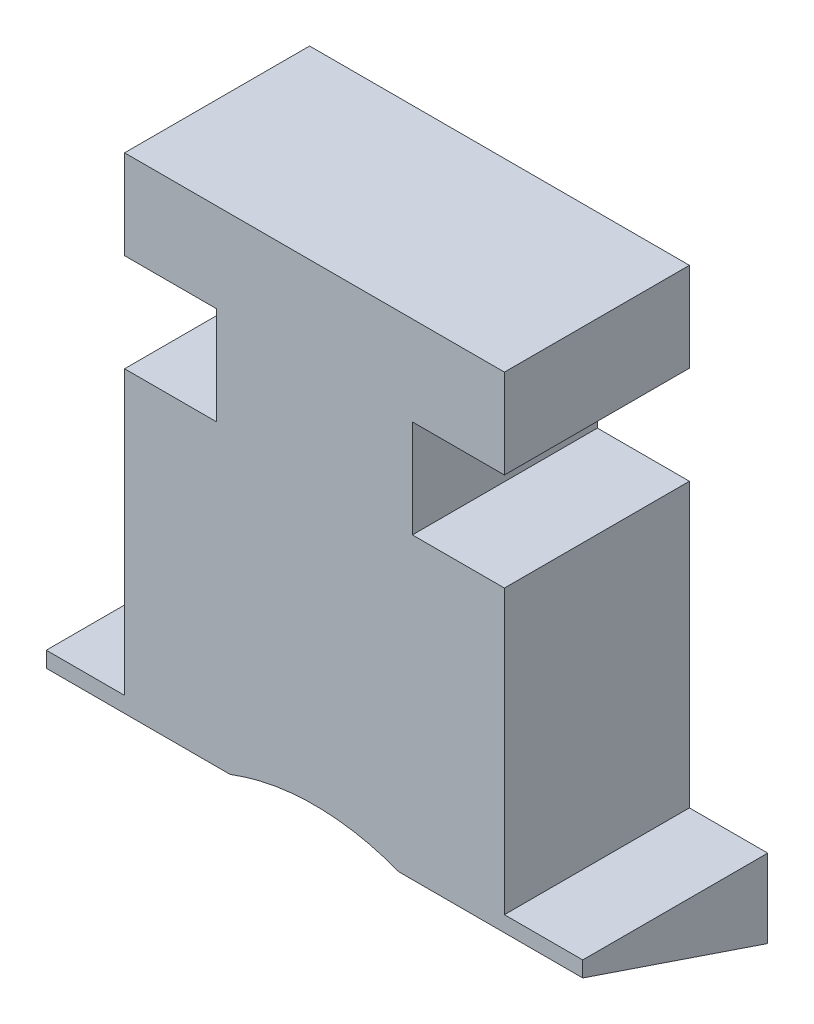
ISO-10303-21;
HEADER;
FILE_DESCRIPTION(('STEP AP214'),'2;1');
FILE_NAME('part.step','',(''),(''),'','','');
FILE_SCHEMA(('AUTOMOTIVE_DESIGN { 1 0 10303 214 1 1 1 1 }'));
ENDSEC;
DATA;
#1=APPLICATION_CONTEXT('core data for automotive mechanical design processes');
#2=APPLICATION_PROTOCOL_DEFINITION('international standard','automotive_design',2000,#1);
#3=PRODUCT_CONTEXT('',#1,'mechanical');
#4=PRODUCT('Part','Part','',(#3));
#5=PRODUCT_RELATED_PRODUCT_CATEGORY('part','',(#4));
#6=PRODUCT_DEFINITION_FORMATION('','',#4);
#7=PRODUCT_DEFINITION_CONTEXT('part definition',#1,'design');
#8=PRODUCT_DEFINITION('design','',#6,#7);
#9=PRODUCT_DEFINITION_SHAPE('','',#8);
#10=(LENGTH_UNIT() NAMED_UNIT(*) SI_UNIT(.MILLI.,.METRE.));
#11=(NAMED_UNIT(*) PLANE_ANGLE_UNIT() SI_UNIT($,.RADIAN.));
#12=(NAMED_UNIT(*) SI_UNIT($,.STERADIAN.) SOLID_ANGLE_UNIT());
#13=UNCERTAINTY_MEASURE_WITH_UNIT(LENGTH_MEASURE(1.E-05),#10,'distance_accuracy_value','');
#14=(GEOMETRIC_REPRESENTATION_CONTEXT(3) GLOBAL_UNCERTAINTY_ASSIGNED_CONTEXT((#13)) GLOBAL_UNIT_ASSIGNED_CONTEXT((#10,
#11,#12)) REPRESENTATION_CONTEXT('',''));
#15=CARTESIAN_POINT('',(0.,0.,0.));
#16=DIRECTION('',(0.,0.,1.));
#17=DIRECTION('',(1.,0.,0.));
#18=AXIS2_PLACEMENT_3D('',#15,#16,#17);
#19=CARTESIAN_POINT('',(6.1595,15.24,0.));
#20=DIRECTION('',(1.,0.,0.));
#21=DIRECTION('',(0.,0.,-1.));
#22=AXIS2_PLACEMENT_3D('',#19,#20,#21);
#23=PLANE('',#22);
#24=DIRECTION('',(0.,-1.,0.));
#25=VECTOR('',#24,1.);
#26=CARTESIAN_POINT('',(6.1595,15.24,3.));
#27=LINE('',#26,#25);
#28=CARTESIAN_POINT('',(6.1595,15.24,3.));
#29=VERTEX_POINT('',#28);
#30=CARTESIAN_POINT('',(6.1595,12.35,3.));
#31=VERTEX_POINT('',#30);
#32=EDGE_CURVE('E324',#29,#31,#27,.T.);
#33=ORIENTED_EDGE('',*,*,#32,.T.);
#34=DIRECTION('',(0.,0.,-1.));
#35=VECTOR('',#34,1.);
#36=CARTESIAN_POINT('',(6.1595,12.35,3.));
#37=LINE('',#36,#35);
#38=CARTESIAN_POINT('',(6.1595,12.35,-3.));
#39=VERTEX_POINT('',#38);
#40=EDGE_CURVE('E235',#31,#39,#37,.T.);
#41=ORIENTED_EDGE('',*,*,#40,.T.);
#42=DIRECTION('',(0.,-1.,0.));
#43=VECTOR('',#42,1.);
#44=CARTESIAN_POINT('',(6.1595,15.24,-3.));
#45=LINE('',#44,#43);
#46=CARTESIAN_POINT('',(6.1595,15.24,-3.));
#47=VERTEX_POINT('',#46);
#48=EDGE_CURVE('E339',#47,#39,#45,.T.);
#49=ORIENTED_EDGE('',*,*,#48,.F.);
#50=DIRECTION('',(0.,0.,1.));
#51=VECTOR('',#50,1.);
#52=CARTESIAN_POINT('',(6.1595,15.24,0.));
#53=LINE('',#52,#51);
#54=EDGE_CURVE('E302',#47,#29,#53,.T.);
#55=ORIENTED_EDGE('',*,*,#54,.T.);
#56=EDGE_LOOP('',(#33,#41,#49,#55));
#57=FACE_BOUND('',#56,.T.);
#58=ADVANCED_FACE('F48',(#57),#23,.T.);
#59=CARTESIAN_POINT('',(0.,15.24,-3.));
#60=DIRECTION('',(0.,0.,-1.));
#61=DIRECTION('',(-1.,0.,0.));
#62=AXIS2_PLACEMENT_3D('',#59,#60,#61);
#63=PLANE('',#62);
#64=DIRECTION('',(-1.,0.,0.));
#65=VECTOR('',#64,1.);
#66=CARTESIAN_POINT('',(0.,9.175,-3.));
#67=LINE('',#66,#65);
#68=CARTESIAN_POINT('',(6.1595,9.175,-3.));
#69=VERTEX_POINT('',#68);
#70=CARTESIAN_POINT('',(3.175,9.175,-3.));
#71=VERTEX_POINT('',#70);
#72=EDGE_CURVE('E208',#69,#71,#67,.T.);
#73=ORIENTED_EDGE('',*,*,#72,.F.);
#74=CARTESIAN_POINT('',(6.1595,0.,-3.));
#75=VERTEX_POINT('',#74);
#76=EDGE_CURVE('E338',#69,#75,#45,.T.);
#77=ORIENTED_EDGE('',*,*,#76,.T.);
#78=DIRECTION('',(1.,0.,0.));
#79=VECTOR('',#78,1.);
#80=CARTESIAN_POINT('',(0.,0.,-3.));
#81=LINE('',#80,#79);
#82=CARTESIAN_POINT('',(8.6995,0.,-3.));
#83=VERTEX_POINT('',#82);
#84=EDGE_CURVE('E281',#75,#83,#81,.T.);
#85=ORIENTED_EDGE('',*,*,#84,.T.);
#86=DIRECTION('',(0.,1.,0.));
#87=VECTOR('',#86,1.);
#88=CARTESIAN_POINT('',(8.6995,-2.54,-3.));
#89=LINE('',#88,#87);
#90=CARTESIAN_POINT('',(8.6995,-2.54,-3.));
#91=VERTEX_POINT('',#90);
#92=EDGE_CURVE('E296',#91,#83,#89,.T.);
#93=ORIENTED_EDGE('',*,*,#92,.F.);
#94=DIRECTION('',(1.,0.,0.));
#95=VECTOR('',#94,1.);
#96=CARTESIAN_POINT('',(0.,-2.54,-3.));
#97=LINE('',#96,#95);
#98=CARTESIAN_POINT('',(-8.6995,-2.54,-3.));
#99=VERTEX_POINT('',#98);
#100=EDGE_CURVE('E268',#99,#91,#97,.T.);
#101=ORIENTED_EDGE('',*,*,#100,.F.);
#102=DIRECTION('',(0.,1.,0.));
#103=VECTOR('',#102,1.);
#104=CARTESIAN_POINT('',(-8.6995,-2.54,-3.));
#105=LINE('',#104,#103);
#106=CARTESIAN_POINT('',(-8.6995,0.,-3.));
#107=VERTEX_POINT('',#106);
#108=EDGE_CURVE('E293',#99,#107,#105,.T.);
#109=ORIENTED_EDGE('',*,*,#108,.T.);
#110=CARTESIAN_POINT('',(-6.1595,0.,-3.));
#111=VERTEX_POINT('',#110);
#112=EDGE_CURVE('E282',#107,#111,#81,.T.);
#113=ORIENTED_EDGE('',*,*,#112,.T.);
#114=DIRECTION('',(0.,-1.,0.));
#115=VECTOR('',#114,1.);
#116=CARTESIAN_POINT('',(-6.1595,15.24,-3.));
#117=LINE('',#116,#115);
#118=CARTESIAN_POINT('',(-6.1595,9.175,-3.));
#119=VERTEX_POINT('',#118);
#120=EDGE_CURVE('E333',#119,#111,#117,.T.);
#121=ORIENTED_EDGE('',*,*,#120,.F.);
#122=DIRECTION('',(-1.,0.,0.));
#123=VECTOR('',#122,1.);
#124=CARTESIAN_POINT('',(0.,9.175,-3.));
#125=LINE('',#124,#123);
#126=CARTESIAN_POINT('',(-3.175,9.175,-3.));
#127=VERTEX_POINT('',#126);
#128=EDGE_CURVE('E245',#127,#119,#125,.T.);
#129=ORIENTED_EDGE('',*,*,#128,.F.);
#130=DIRECTION('',(0.,-1.,0.));
#131=VECTOR('',#130,1.);
#132=CARTESIAN_POINT('',(-3.17500000000001,0.,-3.));
#133=LINE('',#132,#131);
#134=CARTESIAN_POINT('',(-3.175,12.35,-3.));
#135=VERTEX_POINT('',#134);
#136=EDGE_CURVE('E198',#135,#127,#133,.T.);
#137=ORIENTED_EDGE('',*,*,#136,.F.);
#138=DIRECTION('',(-1.,0.,0.));
#139=VECTOR('',#138,1.);
#140=CARTESIAN_POINT('',(0.,12.35,-3.));
#141=LINE('',#140,#139);
#142=CARTESIAN_POINT('',(-6.1595,12.35,-3.));
#143=VERTEX_POINT('',#142);
#144=EDGE_CURVE('E193',#135,#143,#141,.T.);
#145=ORIENTED_EDGE('',*,*,#144,.T.);
#146=CARTESIAN_POINT('',(-6.1595,15.24,-3.));
#147=VERTEX_POINT('',#146);
#148=EDGE_CURVE('E334',#147,#143,#117,.T.);
#149=ORIENTED_EDGE('',*,*,#148,.F.);
#150=DIRECTION('',(1.,0.,0.));
#151=VECTOR('',#150,1.);
#152=CARTESIAN_POINT('',(0.,15.24,-3.));
#153=LINE('',#152,#151);
#154=EDGE_CURVE('E306',#147,#47,#153,.T.);
#155=ORIENTED_EDGE('',*,*,#154,.T.);
#156=ORIENTED_EDGE('',*,*,#48,.T.);
#157=DIRECTION('',(-1.,0.,0.));
#158=VECTOR('',#157,1.);
#159=CARTESIAN_POINT('',(0.,12.35,-3.));
#160=LINE('',#159,#158);
#161=CARTESIAN_POINT('',(3.175,12.35,-3.));
#162=VERTEX_POINT('',#161);
#163=EDGE_CURVE('E220',#39,#162,#160,.T.);
#164=ORIENTED_EDGE('',*,*,#163,.T.);
#165=DIRECTION('',(0.,-1.,0.));
#166=VECTOR('',#165,1.);
#167=CARTESIAN_POINT('',(3.175,0.,-3.));
#168=LINE('',#167,#166);
#169=EDGE_CURVE('E216',#162,#71,#168,.T.);
#170=ORIENTED_EDGE('',*,*,#169,.T.);
#171=EDGE_LOOP('',(#73,#77,#85,#93,#101,#109,#113,#121,#129,#137,#145,#149,#155,#156,#164,#170));
#172=FACE_BOUND('',#171,.T.);
#173=ADVANCED_FACE('F361',(#172),#63,.T.);
#174=CARTESIAN_POINT('',(-6.1595,15.24,0.));
#175=DIRECTION('',(1.,0.,0.));
#176=DIRECTION('',(0.,0.,-1.));
#177=AXIS2_PLACEMENT_3D('',#174,#175,#176);
#178=PLANE('',#177);
#179=DIRECTION('',(0.,0.,-1.));
#180=VECTOR('',#179,1.);
#181=CARTESIAN_POINT('',(-6.1595,12.35,3.));
#182=LINE('',#181,#180);
#183=CARTESIAN_POINT('',(-6.1595,12.35,3.));
#184=VERTEX_POINT('',#183);
#185=EDGE_CURVE('E221',#184,#143,#182,.T.);
#186=ORIENTED_EDGE('',*,*,#185,.F.);
#187=DIRECTION('',(0.,-1.,0.));
#188=VECTOR('',#187,1.);
#189=CARTESIAN_POINT('',(-6.1595,15.24,3.));
#190=LINE('',#189,#188);
#191=CARTESIAN_POINT('',(-6.1595,15.24,3.));
#192=VERTEX_POINT('',#191);
#193=EDGE_CURVE('E329',#192,#184,#190,.T.);
#194=ORIENTED_EDGE('',*,*,#193,.F.);
#195=DIRECTION('',(0.,0.,1.));
#196=VECTOR('',#195,1.);
#197=CARTESIAN_POINT('',(-6.1595,15.24,0.));
#198=LINE('',#197,#196);
#199=EDGE_CURVE('E311',#147,#192,#198,.T.);
#200=ORIENTED_EDGE('',*,*,#199,.F.);
#201=ORIENTED_EDGE('',*,*,#148,.T.);
#202=EDGE_LOOP('',(#186,#194,#200,#201));
#203=FACE_BOUND('',#202,.T.);
#204=ADVANCED_FACE('F410',(#203),#178,.F.);
#205=CARTESIAN_POINT('',(0.,15.24,3.));
#206=DIRECTION('',(0.,0.,-1.));
#207=DIRECTION('',(-1.,0.,0.));
#208=AXIS2_PLACEMENT_3D('',#205,#206,#207);
#209=PLANE('',#208);
#210=DIRECTION('',(-1.,0.,0.));
#211=VECTOR('',#210,1.);
#212=CARTESIAN_POINT('',(8.6995,-0.508,3.));
#213=LINE('',#212,#211);
#214=CARTESIAN_POINT('',(-2.73566372202433,-0.508000000000001,3.));
#215=VERTEX_POINT('',#214);
#216=CARTESIAN_POINT('',(-8.6995,-0.508,3.));
#217=VERTEX_POINT('',#216);
#218=EDGE_CURVE('E186',#215,#217,#213,.T.);
#219=ORIENTED_EDGE('',*,*,#218,.F.);
#220=CARTESIAN_POINT('',(0.,-7.62,3.));
#221=DIRECTION('',(0.,0.,1.));
#222=DIRECTION('',(1.,0.,0.));
#223=AXIS2_PLACEMENT_3D('',#220,#221,#222);
#224=CIRCLE('',#223,7.62);
#225=CARTESIAN_POINT('',(2.73566372202433,-0.508000000000001,3.));
#226=VERTEX_POINT('',#225);
#227=EDGE_CURVE('E174',#226,#215,#224,.T.);
#228=ORIENTED_EDGE('',*,*,#227,.F.);
#229=CARTESIAN_POINT('',(8.6995,-0.508,3.));
#230=VERTEX_POINT('',#229);
#231=EDGE_CURVE('E183',#230,#226,#213,.T.);
#232=ORIENTED_EDGE('',*,*,#231,.F.);
#233=DIRECTION('',(0.,1.,0.));
#234=VECTOR('',#233,1.);
#235=CARTESIAN_POINT('',(8.6995,-2.54,3.));
#236=LINE('',#235,#234);
#237=CARTESIAN_POINT('',(8.6995,0.,3.));
#238=VERTEX_POINT('',#237);
#239=EDGE_CURVE('E271',#230,#238,#236,.T.);
#240=ORIENTED_EDGE('',*,*,#239,.T.);
#241=DIRECTION('',(1.,0.,0.));
#242=VECTOR('',#241,1.);
#243=CARTESIAN_POINT('',(0.,0.,3.));
#244=LINE('',#243,#242);
#245=CARTESIAN_POINT('',(6.1595,0.,3.));
#246=VERTEX_POINT('',#245);
#247=EDGE_CURVE('E231',#246,#238,#244,.T.);
#248=ORIENTED_EDGE('',*,*,#247,.F.);
#249=CARTESIAN_POINT('',(6.1595,9.175,3.));
#250=VERTEX_POINT('',#249);
#251=EDGE_CURVE('E317',#250,#246,#27,.T.);
#252=ORIENTED_EDGE('',*,*,#251,.F.);
#253=DIRECTION('',(-1.,0.,0.));
#254=VECTOR('',#253,1.);
#255=CARTESIAN_POINT('',(0.,9.175,3.));
#256=LINE('',#255,#254);
#257=CARTESIAN_POINT('',(3.175,9.175,3.));
#258=VERTEX_POINT('',#257);
#259=EDGE_CURVE('E211',#250,#258,#256,.T.);
#260=ORIENTED_EDGE('',*,*,#259,.T.);
#261=DIRECTION('',(0.,-1.,0.));
#262=VECTOR('',#261,1.);
#263=CARTESIAN_POINT('',(3.175,0.,3.));
#264=LINE('',#263,#262);
#265=CARTESIAN_POINT('',(3.175,12.35,3.));
#266=VERTEX_POINT('',#265);
#267=EDGE_CURVE('E204',#266,#258,#264,.T.);
#268=ORIENTED_EDGE('',*,*,#267,.F.);
#269=DIRECTION('',(-1.,0.,0.));
#270=VECTOR('',#269,1.);
#271=CARTESIAN_POINT('',(0.,12.35,3.));
#272=LINE('',#271,#270);
#273=EDGE_CURVE('E207',#31,#266,#272,.T.);
#274=ORIENTED_EDGE('',*,*,#273,.F.);
#275=ORIENTED_EDGE('',*,*,#32,.F.);
#276=DIRECTION('',(1.,0.,0.));
#277=VECTOR('',#276,1.);
#278=CARTESIAN_POINT('',(0.,15.24,3.));
#279=LINE('',#278,#277);
#280=EDGE_CURVE('E314',#192,#29,#279,.T.);
#281=ORIENTED_EDGE('',*,*,#280,.F.);
#282=ORIENTED_EDGE('',*,*,#193,.T.);
#283=DIRECTION('',(-1.,0.,0.));
#284=VECTOR('',#283,1.);
#285=CARTESIAN_POINT('',(0.,12.35,3.));
#286=LINE('',#285,#284);
#287=CARTESIAN_POINT('',(-3.175,12.35,3.));
#288=VERTEX_POINT('',#287);
#289=EDGE_CURVE('E241',#288,#184,#286,.T.);
#290=ORIENTED_EDGE('',*,*,#289,.F.);
#291=DIRECTION('',(0.,-1.,0.));
#292=VECTOR('',#291,1.);
#293=CARTESIAN_POINT('',(-3.17500000000001,0.,3.));
#294=LINE('',#293,#292);
#295=CARTESIAN_POINT('',(-3.175,9.175,3.));
#296=VERTEX_POINT('',#295);
#297=EDGE_CURVE('E244',#288,#296,#294,.T.);
#298=ORIENTED_EDGE('',*,*,#297,.T.);
#299=DIRECTION('',(-1.,0.,0.));
#300=VECTOR('',#299,1.);
#301=CARTESIAN_POINT('',(0.,9.175,3.));
#302=LINE('',#301,#300);
#303=CARTESIAN_POINT('',(-6.1595,9.175,3.));
#304=VERTEX_POINT('',#303);
#305=EDGE_CURVE('E71',#296,#304,#302,.T.);
#306=ORIENTED_EDGE('',*,*,#305,.T.);
#307=CARTESIAN_POINT('',(-6.1595,0.,3.));
#308=VERTEX_POINT('',#307);
#309=EDGE_CURVE('E328',#304,#308,#190,.T.);
#310=ORIENTED_EDGE('',*,*,#309,.T.);
#311=CARTESIAN_POINT('',(-8.6995,0.,3.));
#312=VERTEX_POINT('',#311);
#313=EDGE_CURVE('E273',#312,#308,#244,.T.);
#314=ORIENTED_EDGE('',*,*,#313,.F.);
#315=DIRECTION('',(0.,1.,0.));
#316=VECTOR('',#315,1.);
#317=CARTESIAN_POINT('',(-8.6995,-2.54,3.));
#318=LINE('',#317,#316);
#319=EDGE_CURVE('E289',#217,#312,#318,.T.);
#320=ORIENTED_EDGE('',*,*,#319,.F.);
#321=EDGE_LOOP('',(#219,#228,#232,#240,#248,#252,#260,#268,#274,#275,#281,#282,#290,#298,#306,
#310,#314,#320));
#322=FACE_BOUND('',#321,.T.);
#323=ADVANCED_FACE('F182',(#322),#209,.F.);
#324=DIRECTION('',(0.,0.,-1.));
#325=VECTOR('',#324,1.);
#326=CARTESIAN_POINT('',(6.1595,9.175,3.));
#327=LINE('',#326,#325);
#328=EDGE_CURVE('E232',#250,#69,#327,.T.);
#329=ORIENTED_EDGE('',*,*,#328,.F.);
#330=ORIENTED_EDGE('',*,*,#251,.T.);
#331=DIRECTION('',(0.,0.,1.));
#332=VECTOR('',#331,1.);
#333=CARTESIAN_POINT('',(6.1595,0.,0.));
#334=LINE('',#333,#332);
#335=EDGE_CURVE('E292',#75,#246,#334,.T.);
#336=ORIENTED_EDGE('',*,*,#335,.F.);
#337=ORIENTED_EDGE('',*,*,#76,.F.);
#338=EDGE_LOOP('',(#329,#330,#336,#337));
#339=FACE_BOUND('',#338,.T.);
#340=ADVANCED_FACE('F50',(#339),#23,.T.);
#341=ORIENTED_EDGE('',*,*,#309,.F.);
#342=DIRECTION('',(0.,0.,-1.));
#343=VECTOR('',#342,1.);
#344=CARTESIAN_POINT('',(-6.1595,9.175,3.));
#345=LINE('',#344,#343);
#346=EDGE_CURVE('E259',#304,#119,#345,.T.);
#347=ORIENTED_EDGE('',*,*,#346,.T.);
#348=ORIENTED_EDGE('',*,*,#120,.T.);
#349=DIRECTION('',(0.,0.,1.));
#350=VECTOR('',#349,1.);
#351=CARTESIAN_POINT('',(-6.1595,0.,0.));
#352=LINE('',#351,#350);
#353=EDGE_CURVE('E307',#111,#308,#352,.T.);
#354=ORIENTED_EDGE('',*,*,#353,.T.);
#355=EDGE_LOOP('',(#341,#347,#348,#354));
#356=FACE_BOUND('',#355,.T.);
#357=ADVANCED_FACE('F419',(#356),#178,.F.);
#358=CARTESIAN_POINT('',(0.,15.24,0.));
#359=DIRECTION('',(0.,1.,0.));
#360=DIRECTION('',(0.,0.,1.));
#361=AXIS2_PLACEMENT_3D('',#358,#359,#360);
#362=PLANE('',#361);
#363=ORIENTED_EDGE('',*,*,#54,.F.);
#364=ORIENTED_EDGE('',*,*,#154,.F.);
#365=ORIENTED_EDGE('',*,*,#199,.T.);
#366=ORIENTED_EDGE('',*,*,#280,.T.);
#367=EDGE_LOOP('',(#363,#364,#365,#366));
#368=FACE_BOUND('',#367,.T.);
#369=ADVANCED_FACE('F403',(#368),#362,.T.);
#370=CARTESIAN_POINT('',(0.,0.,0.));
#371=DIRECTION('',(0.,1.,0.));
#372=DIRECTION('',(0.,0.,1.));
#373=AXIS2_PLACEMENT_3D('',#370,#371,#372);
#374=PLANE('',#373);
#375=ORIENTED_EDGE('',*,*,#353,.F.);
#376=ORIENTED_EDGE('',*,*,#112,.F.);
#377=DIRECTION('',(0.,0.,1.));
#378=VECTOR('',#377,1.);
#379=CARTESIAN_POINT('',(-8.6995,0.,0.));
#380=LINE('',#379,#378);
#381=EDGE_CURVE('E272',#107,#312,#380,.T.);
#382=ORIENTED_EDGE('',*,*,#381,.T.);
#383=ORIENTED_EDGE('',*,*,#313,.T.);
#384=EDGE_LOOP('',(#375,#376,#382,#383));
#385=FACE_BOUND('',#384,.T.);
#386=ADVANCED_FACE('F357',(#385),#374,.T.);
#387=CARTESIAN_POINT('',(-8.6995,-2.54,0.));
#388=DIRECTION('',(-1.,0.,0.));
#389=DIRECTION('',(0.,0.,1.));
#390=AXIS2_PLACEMENT_3D('',#387,#388,#389);
#391=PLANE('',#390);
#392=DIRECTION('',(0.,-0.320770488140239,-0.947156953169997));
#393=VECTOR('',#392,1.);
#394=CARTESIAN_POINT('',(-8.6995,-2.54,-3.));
#395=LINE('',#394,#393);
#396=EDGE_CURVE('E202',#217,#99,#395,.T.);
#397=ORIENTED_EDGE('',*,*,#396,.F.);
#398=ORIENTED_EDGE('',*,*,#319,.T.);
#399=ORIENTED_EDGE('',*,*,#381,.F.);
#400=ORIENTED_EDGE('',*,*,#108,.F.);
#401=EDGE_LOOP('',(#397,#398,#399,#400));
#402=FACE_BOUND('',#401,.T.);
#403=ADVANCED_FACE('F348',(#402),#391,.T.);
#404=CARTESIAN_POINT('',(8.6995,-2.54,0.));
#405=DIRECTION('',(-1.,0.,0.));
#406=DIRECTION('',(0.,0.,1.));
#407=AXIS2_PLACEMENT_3D('',#404,#405,#406);
#408=PLANE('',#407);
#409=ORIENTED_EDGE('',*,*,#239,.F.);
#410=DIRECTION('',(0.,-0.320770488140239,-0.947156953169997));
#411=VECTOR('',#410,1.);
#412=CARTESIAN_POINT('',(8.6995,-2.54,-3.));
#413=LINE('',#412,#411);
#414=EDGE_CURVE('E191',#230,#91,#413,.T.);
#415=ORIENTED_EDGE('',*,*,#414,.T.);
#416=ORIENTED_EDGE('',*,*,#92,.T.);
#417=DIRECTION('',(0.,0.,1.));
#418=VECTOR('',#417,1.);
#419=CARTESIAN_POINT('',(8.6995,0.,0.));
#420=LINE('',#419,#418);
#421=EDGE_CURVE('E277',#83,#238,#420,.T.);
#422=ORIENTED_EDGE('',*,*,#421,.T.);
#423=EDGE_LOOP('',(#409,#415,#416,#422));
#424=FACE_BOUND('',#423,.T.);
#425=ADVANCED_FACE('F365',(#424),#408,.F.);
#426=ORIENTED_EDGE('',*,*,#84,.F.);
#427=ORIENTED_EDGE('',*,*,#335,.T.);
#428=ORIENTED_EDGE('',*,*,#247,.T.);
#429=ORIENTED_EDGE('',*,*,#421,.F.);
#430=EDGE_LOOP('',(#426,#427,#428,#429));
#431=FACE_BOUND('',#430,.T.);
#432=ADVANCED_FACE('F375',(#431),#374,.T.);
#433=CARTESIAN_POINT('',(0.,12.35,3.));
#434=DIRECTION('',(0.,-1.,0.));
#435=DIRECTION('',(0.,0.,-1.));
#436=AXIS2_PLACEMENT_3D('',#433,#434,#435);
#437=PLANE('',#436);
#438=ORIENTED_EDGE('',*,*,#144,.F.);
#439=DIRECTION('',(0.,0.,-1.));
#440=VECTOR('',#439,1.);
#441=CARTESIAN_POINT('',(-3.175,12.35,3.));
#442=LINE('',#441,#440);
#443=EDGE_CURVE('E250',#288,#135,#442,.T.);
#444=ORIENTED_EDGE('',*,*,#443,.F.);
#445=ORIENTED_EDGE('',*,*,#289,.T.);
#446=ORIENTED_EDGE('',*,*,#185,.T.);
#447=EDGE_LOOP('',(#438,#444,#445,#446));
#448=FACE_BOUND('',#447,.T.);
#449=ADVANCED_FACE('F414',(#448),#437,.T.);
#450=CARTESIAN_POINT('',(0.,9.175,3.));
#451=DIRECTION('',(0.,-1.,0.));
#452=DIRECTION('',(0.,0.,-1.));
#453=AXIS2_PLACEMENT_3D('',#450,#451,#452);
#454=PLANE('',#453);
#455=ORIENTED_EDGE('',*,*,#128,.T.);
#456=ORIENTED_EDGE('',*,*,#346,.F.);
#457=ORIENTED_EDGE('',*,*,#305,.F.);
#458=DIRECTION('',(0.,0.,-1.));
#459=VECTOR('',#458,1.);
#460=CARTESIAN_POINT('',(-3.175,9.175,3.));
#461=LINE('',#460,#459);
#462=EDGE_CURVE('E263',#296,#127,#461,.T.);
#463=ORIENTED_EDGE('',*,*,#462,.T.);
#464=EDGE_LOOP('',(#455,#456,#457,#463));
#465=FACE_BOUND('',#464,.T.);
#466=ADVANCED_FACE('F417',(#465),#454,.F.);
#467=CARTESIAN_POINT('',(-3.17500000000001,0.,3.));
#468=DIRECTION('',(1.,0.,0.));
#469=DIRECTION('',(0.,1.,0.));
#470=AXIS2_PLACEMENT_3D('',#467,#468,#469);
#471=PLANE('',#470);
#472=ORIENTED_EDGE('',*,*,#136,.T.);
#473=ORIENTED_EDGE('',*,*,#462,.F.);
#474=ORIENTED_EDGE('',*,*,#297,.F.);
#475=ORIENTED_EDGE('',*,*,#443,.T.);
#476=EDGE_LOOP('',(#472,#473,#474,#475));
#477=FACE_BOUND('',#476,.T.);
#478=ADVANCED_FACE('F416',(#477),#471,.F.);
#479=CARTESIAN_POINT('',(3.175,0.,3.));
#480=DIRECTION('',(1.,0.,0.));
#481=DIRECTION('',(0.,1.,0.));
#482=AXIS2_PLACEMENT_3D('',#479,#480,#481);
#483=PLANE('',#482);
#484=ORIENTED_EDGE('',*,*,#169,.F.);
#485=DIRECTION('',(0.,0.,-1.));
#486=VECTOR('',#485,1.);
#487=CARTESIAN_POINT('',(3.175,12.35,3.));
#488=LINE('',#487,#486);
#489=EDGE_CURVE('E215',#266,#162,#488,.T.);
#490=ORIENTED_EDGE('',*,*,#489,.F.);
#491=ORIENTED_EDGE('',*,*,#267,.T.);
#492=DIRECTION('',(0.,0.,-1.));
#493=VECTOR('',#492,1.);
#494=CARTESIAN_POINT('',(3.175,9.175,3.));
#495=LINE('',#494,#493);
#496=EDGE_CURVE('E228',#258,#71,#495,.T.);
#497=ORIENTED_EDGE('',*,*,#496,.T.);
#498=EDGE_LOOP('',(#484,#490,#491,#497));
#499=FACE_BOUND('',#498,.T.);
#500=ADVANCED_FACE('F393',(#499),#483,.T.);
#501=CARTESIAN_POINT('',(0.,9.175,3.));
#502=DIRECTION('',(0.,-1.,0.));
#503=DIRECTION('',(0.,0.,-1.));
#504=AXIS2_PLACEMENT_3D('',#501,#502,#503);
#505=PLANE('',#504);
#506=ORIENTED_EDGE('',*,*,#72,.T.);
#507=ORIENTED_EDGE('',*,*,#496,.F.);
#508=ORIENTED_EDGE('',*,*,#259,.F.);
#509=ORIENTED_EDGE('',*,*,#328,.T.);
#510=EDGE_LOOP('',(#506,#507,#508,#509));
#511=FACE_BOUND('',#510,.T.);
#512=ADVANCED_FACE('F390',(#511),#505,.F.);
#513=CARTESIAN_POINT('',(0.,12.35,3.));
#514=DIRECTION('',(0.,-1.,0.));
#515=DIRECTION('',(0.,0.,-1.));
#516=AXIS2_PLACEMENT_3D('',#513,#514,#515);
#517=PLANE('',#516);
#518=ORIENTED_EDGE('',*,*,#163,.F.);
#519=ORIENTED_EDGE('',*,*,#40,.F.);
#520=ORIENTED_EDGE('',*,*,#273,.T.);
#521=ORIENTED_EDGE('',*,*,#489,.T.);
#522=EDGE_LOOP('',(#518,#519,#520,#521));
#523=FACE_BOUND('',#522,.T.);
#524=ADVANCED_FACE('F396',(#523),#517,.T.);
#525=CARTESIAN_POINT('',(8.6995,-2.54,-3.));
#526=DIRECTION('',(0.,0.947156953169997,-0.320770488140239));
#527=DIRECTION('',(0.,0.320770488140239,0.947156953169997));
#528=AXIS2_PLACEMENT_3D('',#525,#526,#527);
#529=PLANE('',#528);
#530=ORIENTED_EDGE('',*,*,#231,.T.);
#531=CARTESIAN_POINT('',(0.,-7.62,-18.));
#532=DIRECTION('',(0.,0.947156953169997,-0.320770488140239));
#533=DIRECTION('',(0.,0.320770488140239,0.947156953169997));
#534=AXIS2_PLACEMENT_3D('',#531,#532,#533);
#535=ELLIPSE('',#534,23.7553025659536,7.62);
#536=CARTESIAN_POINT('',(4.64997318940897,-1.58326666666667,-0.175));
#537=VERTEX_POINT('',#536);
#538=EDGE_CURVE('E11',#226,#537,#535,.T.);
#539=ORIENTED_EDGE('',*,*,#538,.T.);
#540=DIRECTION('',(1.,0.,0.));
#541=VECTOR('',#540,1.);
#542=CARTESIAN_POINT('',(8.6995,-1.58326666666667,-0.175));
#543=LINE('',#542,#541);
#544=CARTESIAN_POINT('',(-4.64997318940897,-1.58326666666667,-0.175));
#545=VERTEX_POINT('',#544);
#546=EDGE_CURVE('E342',#545,#537,#543,.T.);
#547=ORIENTED_EDGE('',*,*,#546,.F.);
#548=EDGE_CURVE('E52',#545,#215,#535,.T.);
#549=ORIENTED_EDGE('',*,*,#548,.T.);
#550=ORIENTED_EDGE('',*,*,#218,.T.);
#551=ORIENTED_EDGE('',*,*,#396,.T.);
#552=ORIENTED_EDGE('',*,*,#100,.T.);
#553=ORIENTED_EDGE('',*,*,#414,.F.);
#554=EDGE_LOOP('',(#530,#539,#547,#549,#550,#551,#552,#553));
#555=FACE_BOUND('',#554,.T.);
#556=ADVANCED_FACE('F189',(#555),#529,.F.);
#557=CARTESIAN_POINT('',(0.,-7.62,-0.175));
#558=DIRECTION('',(0.,0.,1.));
#559=DIRECTION('',(1.,0.,0.));
#560=AXIS2_PLACEMENT_3D('',#557,#558,#559);
#561=CYLINDRICAL_SURFACE('',#560,7.62);
#562=ORIENTED_EDGE('',*,*,#227,.T.);
#563=ORIENTED_EDGE('',*,*,#548,.F.);
#564=CARTESIAN_POINT('',(0.,-7.62,-0.175));
#565=DIRECTION('',(0.,0.,1.));
#566=DIRECTION('',(1.,0.,0.));
#567=AXIS2_PLACEMENT_3D('',#564,#565,#566);
#568=CIRCLE('',#567,7.62);
#569=EDGE_CURVE('E63',#537,#545,#568,.T.);
#570=ORIENTED_EDGE('',*,*,#569,.F.);
#571=ORIENTED_EDGE('',*,*,#538,.F.);
#572=EDGE_LOOP('',(#562,#563,#570,#571));
#573=FACE_BOUND('',#572,.T.);
#574=ADVANCED_FACE('F173',(#573),#561,.F.);
#575=CARTESIAN_POINT('',(0.,-7.62,-0.175));
#576=DIRECTION('',(0.,0.,1.));
#577=DIRECTION('',(1.,0.,0.));
#578=AXIS2_PLACEMENT_3D('',#575,#576,#577);
#579=PLANE('',#578);
#580=ORIENTED_EDGE('',*,*,#546,.T.);
#581=ORIENTED_EDGE('',*,*,#569,.T.);
#582=EDGE_LOOP('',(#580,#581));
#583=FACE_BOUND('',#582,.T.);
#584=ADVANCED_FACE('F477',(#583),#579,.T.);
#585=CLOSED_SHELL('',(#58,#173,#204,#323,#340,#357,#369,#386,#403,#425,#432,#449,#466,#478,#500,
#512,#524,#556,#574,#584));
#586=MANIFOLD_SOLID_BREP('B2',#585);
#587=ADVANCED_BREP_SHAPE_REPRESENTATION('',(#18,#586),#14);
#588=SHAPE_DEFINITION_REPRESENTATION(#9,#587);
ENDSEC;
END-ISO-10303-21;
